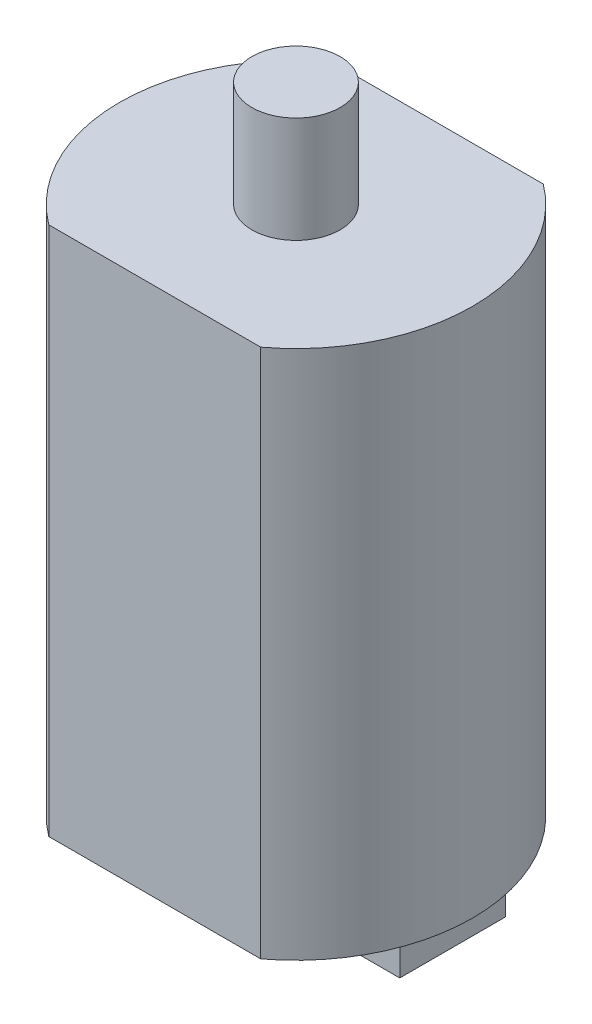
ISO-10303-21;
HEADER;
FILE_DESCRIPTION(('STEP AP214'),'2;1');
FILE_NAME('part.step','',(''),(''),'','','');
FILE_SCHEMA(('AUTOMOTIVE_DESIGN { 1 0 10303 214 1 1 1 1 }'));
ENDSEC;
DATA;
#1=APPLICATION_CONTEXT('core data for automotive mechanical design processes');
#2=APPLICATION_PROTOCOL_DEFINITION('international standard','automotive_design',2000,#1);
#3=PRODUCT_CONTEXT('',#1,'mechanical');
#4=PRODUCT('Part','Part','',(#3));
#5=PRODUCT_RELATED_PRODUCT_CATEGORY('part','',(#4));
#6=PRODUCT_DEFINITION_FORMATION('','',#4);
#7=PRODUCT_DEFINITION_CONTEXT('part definition',#1,'design');
#8=PRODUCT_DEFINITION('design','',#6,#7);
#9=PRODUCT_DEFINITION_SHAPE('','',#8);
#10=(LENGTH_UNIT() NAMED_UNIT(*) SI_UNIT(.MILLI.,.METRE.));
#11=(NAMED_UNIT(*) PLANE_ANGLE_UNIT() SI_UNIT($,.RADIAN.));
#12=(NAMED_UNIT(*) SI_UNIT($,.STERADIAN.) SOLID_ANGLE_UNIT());
#13=UNCERTAINTY_MEASURE_WITH_UNIT(LENGTH_MEASURE(1.E-05),#10,'distance_accuracy_value','');
#14=(GEOMETRIC_REPRESENTATION_CONTEXT(3) GLOBAL_UNCERTAINTY_ASSIGNED_CONTEXT((#13)) GLOBAL_UNIT_ASSIGNED_CONTEXT((#10,
#11,#12)) REPRESENTATION_CONTEXT('',''));
#15=CARTESIAN_POINT('',(0.,0.,0.));
#16=DIRECTION('',(0.,0.,1.));
#17=DIRECTION('',(1.,0.,0.));
#18=AXIS2_PLACEMENT_3D('',#15,#16,#17);
#19=CARTESIAN_POINT('',(0.,0.,0.));
#20=DIRECTION('',(0.,1.,0.));
#21=DIRECTION('',(0.,0.,1.));
#22=AXIS2_PLACEMENT_3D('',#19,#20,#21);
#23=PLANE('',#22);
#24=CARTESIAN_POINT('',(0.,0.,0.));
#25=DIRECTION('',(0.,1.,0.));
#26=DIRECTION('',(0.,0.,1.));
#27=AXIS2_PLACEMENT_3D('',#24,#25,#26);
#28=CIRCLE('',#27,2.);
#29=CARTESIAN_POINT('',(0.,0.,2.));
#30=VERTEX_POINT('',#29);
#31=EDGE_CURVE('E163',#30,#30,#28,.T.);
#32=ORIENTED_EDGE('',*,*,#31,.T.);
#33=EDGE_LOOP('',(#32));
#34=FACE_BOUND('',#33,.T.);
#35=DIRECTION('',(0.,0.,-1.));
#36=VECTOR('',#35,1.);
#37=CARTESIAN_POINT('',(-4.4375,0.,0.));
#38=LINE('',#37,#36);
#39=CARTESIAN_POINT('',(-4.4375,0.,1.5));
#40=VERTEX_POINT('',#39);
#41=CARTESIAN_POINT('',(-4.4375,0.,-1.5));
#42=VERTEX_POINT('',#41);
#43=EDGE_CURVE('E180',#40,#42,#38,.T.);
#44=ORIENTED_EDGE('',*,*,#43,.F.);
#45=DIRECTION('',(-1.,0.,0.));
#46=VECTOR('',#45,1.);
#47=CARTESIAN_POINT('',(0.,0.,1.5));
#48=LINE('',#47,#46);
#49=CARTESIAN_POINT('',(-2.4375,0.,1.5));
#50=VERTEX_POINT('',#49);
#51=EDGE_CURVE('E205',#50,#40,#48,.T.);
#52=ORIENTED_EDGE('',*,*,#51,.F.);
#53=DIRECTION('',(0.,0.,-1.));
#54=VECTOR('',#53,1.);
#55=CARTESIAN_POINT('',(-2.4375,0.,0.));
#56=LINE('',#55,#54);
#57=CARTESIAN_POINT('',(-2.4375,0.,-1.5));
#58=VERTEX_POINT('',#57);
#59=EDGE_CURVE('E209',#50,#58,#56,.T.);
#60=ORIENTED_EDGE('',*,*,#59,.T.);
#61=DIRECTION('',(-1.,0.,0.));
#62=VECTOR('',#61,1.);
#63=CARTESIAN_POINT('',(0.,0.,-1.5));
#64=LINE('',#63,#62);
#65=EDGE_CURVE('E190',#58,#42,#64,.T.);
#66=ORIENTED_EDGE('',*,*,#65,.T.);
#67=EDGE_LOOP('',(#44,#52,#60,#66));
#68=FACE_BOUND('',#67,.T.);
#69=DIRECTION('',(1.,0.,0.));
#70=VECTOR('',#69,1.);
#71=CARTESIAN_POINT('',(0.,0.,4.));
#72=LINE('',#71,#70);
#73=CARTESIAN_POINT('',(-3.,0.,4.));
#74=VERTEX_POINT('',#73);
#75=CARTESIAN_POINT('',(3.,0.,4.));
#76=VERTEX_POINT('',#75);
#77=EDGE_CURVE('E218',#74,#76,#72,.T.);
#78=ORIENTED_EDGE('',*,*,#77,.F.);
#79=CARTESIAN_POINT('',(0.,0.,0.));
#80=DIRECTION('',(0.,1.,0.));
#81=DIRECTION('',(0.,0.,1.));
#82=AXIS2_PLACEMENT_3D('',#79,#80,#81);
#83=CIRCLE('',#82,5.);
#84=CARTESIAN_POINT('',(-3.,0.,-4.));
#85=VERTEX_POINT('',#84);
#86=EDGE_CURVE('E235',#85,#74,#83,.T.);
#87=ORIENTED_EDGE('',*,*,#86,.F.);
#88=DIRECTION('',(1.,0.,0.));
#89=VECTOR('',#88,1.);
#90=CARTESIAN_POINT('',(0.,0.,-4.));
#91=LINE('',#90,#89);
#92=CARTESIAN_POINT('',(3.,0.,-4.));
#93=VERTEX_POINT('',#92);
#94=EDGE_CURVE('E250',#85,#93,#91,.T.);
#95=ORIENTED_EDGE('',*,*,#94,.T.);
#96=EDGE_CURVE('E246',#76,#93,#83,.T.);
#97=ORIENTED_EDGE('',*,*,#96,.F.);
#98=EDGE_LOOP('',(#78,#87,#95,#97));
#99=FACE_BOUND('',#98,.T.);
#100=DIRECTION('',(0.,0.,-1.));
#101=VECTOR('',#100,1.);
#102=CARTESIAN_POINT('',(2.4375,0.,0.));
#103=LINE('',#102,#101);
#104=CARTESIAN_POINT('',(2.4375,0.,1.5));
#105=VERTEX_POINT('',#104);
#106=CARTESIAN_POINT('',(2.4375,0.,-1.5));
#107=VERTEX_POINT('',#106);
#108=EDGE_CURVE('E170',#105,#107,#103,.T.);
#109=ORIENTED_EDGE('',*,*,#108,.F.);
#110=DIRECTION('',(-1.,0.,0.));
#111=VECTOR('',#110,1.);
#112=CARTESIAN_POINT('',(0.,0.,1.5));
#113=LINE('',#112,#111);
#114=CARTESIAN_POINT('',(4.4375,0.,1.5));
#115=VERTEX_POINT('',#114);
#116=EDGE_CURVE('E148',#115,#105,#113,.T.);
#117=ORIENTED_EDGE('',*,*,#116,.F.);
#118=DIRECTION('',(0.,0.,-1.));
#119=VECTOR('',#118,1.);
#120=CARTESIAN_POINT('',(4.4375,0.,0.));
#121=LINE('',#120,#119);
#122=CARTESIAN_POINT('',(4.4375,0.,-1.5));
#123=VERTEX_POINT('',#122);
#124=EDGE_CURVE('E63',#115,#123,#121,.T.);
#125=ORIENTED_EDGE('',*,*,#124,.T.);
#126=DIRECTION('',(-1.,0.,0.));
#127=VECTOR('',#126,1.);
#128=CARTESIAN_POINT('',(0.,0.,-1.5));
#129=LINE('',#128,#127);
#130=EDGE_CURVE('E58',#123,#107,#129,.T.);
#131=ORIENTED_EDGE('',*,*,#130,.T.);
#132=EDGE_LOOP('',(#109,#117,#125,#131));
#133=FACE_BOUND('',#132,.T.);
#134=ADVANCED_FACE('F41',(#34,#68,#99,#133),#23,.F.);
#135=CARTESIAN_POINT('',(0.,15.,4.));
#136=DIRECTION('',(0.,0.,-1.));
#137=DIRECTION('',(-1.,0.,0.));
#138=AXIS2_PLACEMENT_3D('',#135,#136,#137);
#139=PLANE('',#138);
#140=ORIENTED_EDGE('',*,*,#77,.T.);
#141=DIRECTION('',(0.,-1.,0.));
#142=VECTOR('',#141,1.);
#143=CARTESIAN_POINT('',(3.,15.,4.));
#144=LINE('',#143,#142);
#145=CARTESIAN_POINT('',(3.,15.,4.));
#146=VERTEX_POINT('',#145);
#147=EDGE_CURVE('E45',#146,#76,#144,.T.);
#148=ORIENTED_EDGE('',*,*,#147,.F.);
#149=DIRECTION('',(1.,0.,0.));
#150=VECTOR('',#149,1.);
#151=CARTESIAN_POINT('',(0.,15.,4.));
#152=LINE('',#151,#150);
#153=CARTESIAN_POINT('',(-3.,15.,4.));
#154=VERTEX_POINT('',#153);
#155=EDGE_CURVE('E230',#154,#146,#152,.T.);
#156=ORIENTED_EDGE('',*,*,#155,.F.);
#157=DIRECTION('',(0.,-1.,0.));
#158=VECTOR('',#157,1.);
#159=CARTESIAN_POINT('',(-3.,15.,4.));
#160=LINE('',#159,#158);
#161=EDGE_CURVE('E254',#154,#74,#160,.T.);
#162=ORIENTED_EDGE('',*,*,#161,.T.);
#163=EDGE_LOOP('',(#140,#148,#156,#162));
#164=FACE_BOUND('',#163,.T.);
#165=ADVANCED_FACE('F43',(#164),#139,.F.);
#166=CARTESIAN_POINT('',(0.,15.,0.));
#167=DIRECTION('',(0.,-1.,0.));
#168=DIRECTION('',(0.,0.,-1.));
#169=AXIS2_PLACEMENT_3D('',#166,#167,#168);
#170=CYLINDRICAL_SURFACE('',#169,5.);
#171=ORIENTED_EDGE('',*,*,#96,.T.);
#172=DIRECTION('',(0.,-1.,0.));
#173=VECTOR('',#172,1.);
#174=CARTESIAN_POINT('',(3.,15.,-4.));
#175=LINE('',#174,#173);
#176=CARTESIAN_POINT('',(3.,15.,-4.));
#177=VERTEX_POINT('',#176);
#178=EDGE_CURVE('E260',#177,#93,#175,.T.);
#179=ORIENTED_EDGE('',*,*,#178,.F.);
#180=CARTESIAN_POINT('',(0.,15.,0.));
#181=DIRECTION('',(0.,1.,0.));
#182=DIRECTION('',(0.,0.,1.));
#183=AXIS2_PLACEMENT_3D('',#180,#181,#182);
#184=CIRCLE('',#183,5.);
#185=EDGE_CURVE('E234',#146,#177,#184,.T.);
#186=ORIENTED_EDGE('',*,*,#185,.F.);
#187=ORIENTED_EDGE('',*,*,#147,.T.);
#188=EDGE_LOOP('',(#171,#179,#186,#187));
#189=FACE_BOUND('',#188,.T.);
#190=ADVANCED_FACE('F269',(#189),#170,.T.);
#191=CARTESIAN_POINT('',(0.,15.,-4.));
#192=DIRECTION('',(0.,0.,-1.));
#193=DIRECTION('',(-1.,0.,0.));
#194=AXIS2_PLACEMENT_3D('',#191,#192,#193);
#195=PLANE('',#194);
#196=ORIENTED_EDGE('',*,*,#94,.F.);
#197=DIRECTION('',(0.,-1.,0.));
#198=VECTOR('',#197,1.);
#199=CARTESIAN_POINT('',(-3.,15.,-4.));
#200=LINE('',#199,#198);
#201=CARTESIAN_POINT('',(-3.,15.,-4.));
#202=VERTEX_POINT('',#201);
#203=EDGE_CURVE('E258',#202,#85,#200,.T.);
#204=ORIENTED_EDGE('',*,*,#203,.F.);
#205=DIRECTION('',(1.,0.,0.));
#206=VECTOR('',#205,1.);
#207=CARTESIAN_POINT('',(0.,15.,-4.));
#208=LINE('',#207,#206);
#209=EDGE_CURVE('E238',#202,#177,#208,.T.);
#210=ORIENTED_EDGE('',*,*,#209,.T.);
#211=ORIENTED_EDGE('',*,*,#178,.T.);
#212=EDGE_LOOP('',(#196,#204,#210,#211));
#213=FACE_BOUND('',#212,.T.);
#214=ADVANCED_FACE('F276',(#213),#195,.T.);
#215=ORIENTED_EDGE('',*,*,#86,.T.);
#216=ORIENTED_EDGE('',*,*,#161,.F.);
#217=EDGE_CURVE('E239',#202,#154,#184,.T.);
#218=ORIENTED_EDGE('',*,*,#217,.F.);
#219=ORIENTED_EDGE('',*,*,#203,.T.);
#220=EDGE_LOOP('',(#215,#216,#218,#219));
#221=FACE_BOUND('',#220,.T.);
#222=ADVANCED_FACE('F280',(#221),#170,.T.);
#223=CARTESIAN_POINT('',(0.,15.,0.));
#224=DIRECTION('',(0.,1.,0.));
#225=DIRECTION('',(0.,0.,1.));
#226=AXIS2_PLACEMENT_3D('',#223,#224,#225);
#227=PLANE('',#226);
#228=CARTESIAN_POINT('',(0.,15.,0.));
#229=DIRECTION('',(0.,1.,0.));
#230=DIRECTION('',(0.,0.,1.));
#231=AXIS2_PLACEMENT_3D('',#228,#229,#230);
#232=CIRCLE('',#231,1.25);
#233=CARTESIAN_POINT('',(0.,15.,1.25));
#234=VERTEX_POINT('',#233);
#235=EDGE_CURVE('E11',#234,#234,#232,.T.);
#236=ORIENTED_EDGE('',*,*,#235,.F.);
#237=EDGE_LOOP('',(#236));
#238=FACE_BOUND('',#237,.T.);
#239=ORIENTED_EDGE('',*,*,#155,.T.);
#240=ORIENTED_EDGE('',*,*,#185,.T.);
#241=ORIENTED_EDGE('',*,*,#209,.F.);
#242=ORIENTED_EDGE('',*,*,#217,.T.);
#243=EDGE_LOOP('',(#239,#240,#241,#242));
#244=FACE_BOUND('',#243,.T.);
#245=ADVANCED_FACE('F283',(#238,#244),#227,.T.);
#246=CARTESIAN_POINT('',(-4.4375,-1.,0.));
#247=DIRECTION('',(1.,0.,0.));
#248=DIRECTION('',(0.,0.,-1.));
#249=AXIS2_PLACEMENT_3D('',#246,#247,#248);
#250=PLANE('',#249);
#251=ORIENTED_EDGE('',*,*,#43,.T.);
#252=DIRECTION('',(0.,1.,0.));
#253=VECTOR('',#252,1.);
#254=CARTESIAN_POINT('',(-4.4375,-1.,-1.5));
#255=LINE('',#254,#253);
#256=CARTESIAN_POINT('',(-4.4375,-1.,-1.5));
#257=VERTEX_POINT('',#256);
#258=EDGE_CURVE('E214',#257,#42,#255,.T.);
#259=ORIENTED_EDGE('',*,*,#258,.F.);
#260=DIRECTION('',(0.,0.,-1.));
#261=VECTOR('',#260,1.);
#262=CARTESIAN_POINT('',(-4.4375,-1.,0.));
#263=LINE('',#262,#261);
#264=CARTESIAN_POINT('',(-4.4375,-1.,1.5));
#265=VERTEX_POINT('',#264);
#266=EDGE_CURVE('E186',#265,#257,#263,.T.);
#267=ORIENTED_EDGE('',*,*,#266,.F.);
#268=DIRECTION('',(0.,1.,0.));
#269=VECTOR('',#268,1.);
#270=CARTESIAN_POINT('',(-4.4375,-1.,1.5));
#271=LINE('',#270,#269);
#272=EDGE_CURVE('E201',#265,#40,#271,.T.);
#273=ORIENTED_EDGE('',*,*,#272,.T.);
#274=EDGE_LOOP('',(#251,#259,#267,#273));
#275=FACE_BOUND('',#274,.T.);
#276=ADVANCED_FACE('F285',(#275),#250,.F.);
#277=CARTESIAN_POINT('',(0.,-1.,-1.5));
#278=DIRECTION('',(0.,0.,-1.));
#279=DIRECTION('',(-1.,0.,0.));
#280=AXIS2_PLACEMENT_3D('',#277,#278,#279);
#281=PLANE('',#280);
#282=ORIENTED_EDGE('',*,*,#65,.F.);
#283=DIRECTION('',(0.,1.,0.));
#284=VECTOR('',#283,1.);
#285=CARTESIAN_POINT('',(-2.4375,-1.,-1.5));
#286=LINE('',#285,#284);
#287=CARTESIAN_POINT('',(-2.4375,-1.,-1.5));
#288=VERTEX_POINT('',#287);
#289=EDGE_CURVE('E219',#288,#58,#286,.T.);
#290=ORIENTED_EDGE('',*,*,#289,.F.);
#291=DIRECTION('',(-1.,0.,0.));
#292=VECTOR('',#291,1.);
#293=CARTESIAN_POINT('',(0.,-1.,-1.5));
#294=LINE('',#293,#292);
#295=EDGE_CURVE('E197',#288,#257,#294,.T.);
#296=ORIENTED_EDGE('',*,*,#295,.T.);
#297=ORIENTED_EDGE('',*,*,#258,.T.);
#298=EDGE_LOOP('',(#282,#290,#296,#297));
#299=FACE_BOUND('',#298,.T.);
#300=ADVANCED_FACE('F292',(#299),#281,.T.);
#301=CARTESIAN_POINT('',(-2.4375,-1.,0.));
#302=DIRECTION('',(1.,0.,0.));
#303=DIRECTION('',(0.,0.,-1.));
#304=AXIS2_PLACEMENT_3D('',#301,#302,#303);
#305=PLANE('',#304);
#306=ORIENTED_EDGE('',*,*,#59,.F.);
#307=DIRECTION('',(0.,1.,0.));
#308=VECTOR('',#307,1.);
#309=CARTESIAN_POINT('',(-2.4375,-1.,1.5));
#310=LINE('',#309,#308);
#311=CARTESIAN_POINT('',(-2.4375,-1.,1.5));
#312=VERTEX_POINT('',#311);
#313=EDGE_CURVE('E223',#312,#50,#310,.T.);
#314=ORIENTED_EDGE('',*,*,#313,.F.);
#315=DIRECTION('',(0.,0.,-1.));
#316=VECTOR('',#315,1.);
#317=CARTESIAN_POINT('',(-2.4375,-1.,0.));
#318=LINE('',#317,#316);
#319=EDGE_CURVE('E193',#312,#288,#318,.T.);
#320=ORIENTED_EDGE('',*,*,#319,.T.);
#321=ORIENTED_EDGE('',*,*,#289,.T.);
#322=EDGE_LOOP('',(#306,#314,#320,#321));
#323=FACE_BOUND('',#322,.T.);
#324=ADVANCED_FACE('F351',(#323),#305,.T.);
#325=CARTESIAN_POINT('',(0.,-1.,1.5));
#326=DIRECTION('',(0.,0.,-1.));
#327=DIRECTION('',(-1.,0.,0.));
#328=AXIS2_PLACEMENT_3D('',#325,#326,#327);
#329=PLANE('',#328);
#330=ORIENTED_EDGE('',*,*,#51,.T.);
#331=ORIENTED_EDGE('',*,*,#272,.F.);
#332=DIRECTION('',(-1.,0.,0.));
#333=VECTOR('',#332,1.);
#334=CARTESIAN_POINT('',(0.,-1.,1.5));
#335=LINE('',#334,#333);
#336=EDGE_CURVE('E189',#312,#265,#335,.T.);
#337=ORIENTED_EDGE('',*,*,#336,.F.);
#338=ORIENTED_EDGE('',*,*,#313,.T.);
#339=EDGE_LOOP('',(#330,#331,#337,#338));
#340=FACE_BOUND('',#339,.T.);
#341=ADVANCED_FACE('F360',(#340),#329,.F.);
#342=CARTESIAN_POINT('',(0.,-1.,0.));
#343=DIRECTION('',(0.,1.,0.));
#344=DIRECTION('',(0.,0.,1.));
#345=AXIS2_PLACEMENT_3D('',#342,#343,#344);
#346=PLANE('',#345);
#347=ORIENTED_EDGE('',*,*,#266,.T.);
#348=ORIENTED_EDGE('',*,*,#295,.F.);
#349=ORIENTED_EDGE('',*,*,#319,.F.);
#350=ORIENTED_EDGE('',*,*,#336,.T.);
#351=EDGE_LOOP('',(#347,#348,#349,#350));
#352=FACE_BOUND('',#351,.T.);
#353=ADVANCED_FACE('F369',(#352),#346,.F.);
#354=CARTESIAN_POINT('',(2.4375,-1.,0.));
#355=DIRECTION('',(1.,0.,0.));
#356=DIRECTION('',(0.,0.,-1.));
#357=AXIS2_PLACEMENT_3D('',#354,#355,#356);
#358=PLANE('',#357);
#359=ORIENTED_EDGE('',*,*,#108,.T.);
#360=DIRECTION('',(0.,1.,0.));
#361=VECTOR('',#360,1.);
#362=CARTESIAN_POINT('',(2.4375,-1.,-1.5));
#363=LINE('',#362,#361);
#364=CARTESIAN_POINT('',(2.4375,-1.,-1.5));
#365=VERTEX_POINT('',#364);
#366=EDGE_CURVE('E156',#365,#107,#363,.T.);
#367=ORIENTED_EDGE('',*,*,#366,.F.);
#368=DIRECTION('',(0.,0.,-1.));
#369=VECTOR('',#368,1.);
#370=CARTESIAN_POINT('',(2.4375,-1.,0.));
#371=LINE('',#370,#369);
#372=CARTESIAN_POINT('',(2.4375,-1.,1.5));
#373=VERTEX_POINT('',#372);
#374=EDGE_CURVE('E136',#373,#365,#371,.T.);
#375=ORIENTED_EDGE('',*,*,#374,.F.);
#376=DIRECTION('',(0.,1.,0.));
#377=VECTOR('',#376,1.);
#378=CARTESIAN_POINT('',(2.4375,-1.,1.5));
#379=LINE('',#378,#377);
#380=EDGE_CURVE('E146',#373,#105,#379,.T.);
#381=ORIENTED_EDGE('',*,*,#380,.T.);
#382=EDGE_LOOP('',(#359,#367,#375,#381));
#383=FACE_BOUND('',#382,.T.);
#384=ADVANCED_FACE('F155',(#383),#358,.F.);
#385=CARTESIAN_POINT('',(0.,-1.,-1.5));
#386=DIRECTION('',(0.,0.,-1.));
#387=DIRECTION('',(-1.,0.,0.));
#388=AXIS2_PLACEMENT_3D('',#385,#386,#387);
#389=PLANE('',#388);
#390=ORIENTED_EDGE('',*,*,#130,.F.);
#391=DIRECTION('',(0.,1.,0.));
#392=VECTOR('',#391,1.);
#393=CARTESIAN_POINT('',(4.4375,-1.,-1.5));
#394=LINE('',#393,#392);
#395=CARTESIAN_POINT('',(4.4375,-1.,-1.5));
#396=VERTEX_POINT('',#395);
#397=EDGE_CURVE('E181',#396,#123,#394,.T.);
#398=ORIENTED_EDGE('',*,*,#397,.F.);
#399=DIRECTION('',(-1.,0.,0.));
#400=VECTOR('',#399,1.);
#401=CARTESIAN_POINT('',(0.,-1.,-1.5));
#402=LINE('',#401,#400);
#403=EDGE_CURVE('E153',#396,#365,#402,.T.);
#404=ORIENTED_EDGE('',*,*,#403,.T.);
#405=ORIENTED_EDGE('',*,*,#366,.T.);
#406=EDGE_LOOP('',(#390,#398,#404,#405));
#407=FACE_BOUND('',#406,.T.);
#408=ADVANCED_FACE('F386',(#407),#389,.T.);
#409=CARTESIAN_POINT('',(4.4375,-1.,0.));
#410=DIRECTION('',(1.,0.,0.));
#411=DIRECTION('',(0.,0.,-1.));
#412=AXIS2_PLACEMENT_3D('',#409,#410,#411);
#413=PLANE('',#412);
#414=ORIENTED_EDGE('',*,*,#124,.F.);
#415=DIRECTION('',(0.,1.,0.));
#416=VECTOR('',#415,1.);
#417=CARTESIAN_POINT('',(4.4375,-1.,1.5));
#418=LINE('',#417,#416);
#419=CARTESIAN_POINT('',(4.4375,-1.,1.5));
#420=VERTEX_POINT('',#419);
#421=EDGE_CURVE('E152',#420,#115,#418,.T.);
#422=ORIENTED_EDGE('',*,*,#421,.F.);
#423=DIRECTION('',(0.,0.,-1.));
#424=VECTOR('',#423,1.);
#425=CARTESIAN_POINT('',(4.4375,-1.,0.));
#426=LINE('',#425,#424);
#427=EDGE_CURVE('E139',#420,#396,#426,.T.);
#428=ORIENTED_EDGE('',*,*,#427,.T.);
#429=ORIENTED_EDGE('',*,*,#397,.T.);
#430=EDGE_LOOP('',(#414,#422,#428,#429));
#431=FACE_BOUND('',#430,.T.);
#432=ADVANCED_FACE('F394',(#431),#413,.T.);
#433=CARTESIAN_POINT('',(0.,-1.,1.5));
#434=DIRECTION('',(0.,0.,-1.));
#435=DIRECTION('',(-1.,0.,0.));
#436=AXIS2_PLACEMENT_3D('',#433,#434,#435);
#437=PLANE('',#436);
#438=ORIENTED_EDGE('',*,*,#116,.T.);
#439=ORIENTED_EDGE('',*,*,#380,.F.);
#440=DIRECTION('',(-1.,0.,0.));
#441=VECTOR('',#440,1.);
#442=CARTESIAN_POINT('',(0.,-1.,1.5));
#443=LINE('',#442,#441);
#444=EDGE_CURVE('E131',#420,#373,#443,.T.);
#445=ORIENTED_EDGE('',*,*,#444,.F.);
#446=ORIENTED_EDGE('',*,*,#421,.T.);
#447=EDGE_LOOP('',(#438,#439,#445,#446));
#448=FACE_BOUND('',#447,.T.);
#449=ADVANCED_FACE('F147',(#448),#437,.F.);
#450=CARTESIAN_POINT('',(0.,-1.,0.));
#451=DIRECTION('',(0.,1.,0.));
#452=DIRECTION('',(0.,0.,1.));
#453=AXIS2_PLACEMENT_3D('',#450,#451,#452);
#454=PLANE('',#453);
#455=ORIENTED_EDGE('',*,*,#374,.T.);
#456=ORIENTED_EDGE('',*,*,#403,.F.);
#457=ORIENTED_EDGE('',*,*,#427,.F.);
#458=ORIENTED_EDGE('',*,*,#444,.T.);
#459=EDGE_LOOP('',(#455,#456,#457,#458));
#460=FACE_BOUND('',#459,.T.);
#461=ADVANCED_FACE('F133',(#460),#454,.F.);
#462=CARTESIAN_POINT('',(0.,-1.,0.));
#463=DIRECTION('',(0.,1.,0.));
#464=DIRECTION('',(0.,0.,1.));
#465=AXIS2_PLACEMENT_3D('',#462,#463,#464);
#466=CYLINDRICAL_SURFACE('',#465,2.);
#467=CARTESIAN_POINT('',(0.,-1.,0.));
#468=DIRECTION('',(0.,1.,0.));
#469=DIRECTION('',(0.,0.,1.));
#470=AXIS2_PLACEMENT_3D('',#467,#468,#469);
#471=CIRCLE('',#470,2.);
#472=CARTESIAN_POINT('',(0.,-1.,2.));
#473=VERTEX_POINT('',#472);
#474=EDGE_CURVE('E173',#473,#473,#471,.T.);
#475=ORIENTED_EDGE('',*,*,#474,.T.);
#476=EDGE_LOOP('',(#475));
#477=FACE_BOUND('',#476,.T.);
#478=ORIENTED_EDGE('',*,*,#31,.F.);
#479=EDGE_LOOP('',(#478));
#480=FACE_BOUND('',#479,.T.);
#481=ADVANCED_FACE('F418',(#477,#480),#466,.T.);
#482=CARTESIAN_POINT('',(0.,-1.,0.));
#483=DIRECTION('',(0.,1.,0.));
#484=DIRECTION('',(0.,0.,1.));
#485=AXIS2_PLACEMENT_3D('',#482,#483,#484);
#486=PLANE('',#485);
#487=ORIENTED_EDGE('',*,*,#474,.F.);
#488=EDGE_LOOP('',(#487));
#489=FACE_BOUND('',#488,.T.);
#490=ADVANCED_FACE('F426',(#489),#486,.F.);
#491=CARTESIAN_POINT('',(0.,18.,0.));
#492=DIRECTION('',(0.,-1.,0.));
#493=DIRECTION('',(0.,0.,-1.));
#494=AXIS2_PLACEMENT_3D('',#491,#492,#493);
#495=CYLINDRICAL_SURFACE('',#494,1.25);
#496=CARTESIAN_POINT('',(0.,18.,0.));
#497=DIRECTION('',(0.,1.,0.));
#498=DIRECTION('',(0.,0.,1.));
#499=AXIS2_PLACEMENT_3D('',#496,#497,#498);
#500=CIRCLE('',#499,1.25);
#501=CARTESIAN_POINT('',(0.,18.,1.25));
#502=VERTEX_POINT('',#501);
#503=EDGE_CURVE('E469',#502,#502,#500,.T.);
#504=ORIENTED_EDGE('',*,*,#503,.F.);
#505=EDGE_LOOP('',(#504));
#506=FACE_BOUND('',#505,.T.);
#507=ORIENTED_EDGE('',*,*,#235,.T.);
#508=EDGE_LOOP('',(#507));
#509=FACE_BOUND('',#508,.T.);
#510=ADVANCED_FACE('F434',(#506,#509),#495,.T.);
#511=CARTESIAN_POINT('',(0.,18.,0.));
#512=DIRECTION('',(0.,1.,0.));
#513=DIRECTION('',(0.,0.,1.));
#514=AXIS2_PLACEMENT_3D('',#511,#512,#513);
#515=PLANE('',#514);
#516=ORIENTED_EDGE('',*,*,#503,.T.);
#517=EDGE_LOOP('',(#516));
#518=FACE_BOUND('',#517,.T.);
#519=ADVANCED_FACE('F442',(#518),#515,.T.);
#520=CLOSED_SHELL('',(#134,#165,#190,#214,#222,#245,#276,#300,#324,#341,#353,#384,#408,#432,
#449,#461,#481,#490,#510,#519));
#521=MANIFOLD_SOLID_BREP('B2',#520);
#522=ADVANCED_BREP_SHAPE_REPRESENTATION('',(#18,#521),#14);
#523=SHAPE_DEFINITION_REPRESENTATION(#9,#522);
ENDSEC;
END-ISO-10303-21;
